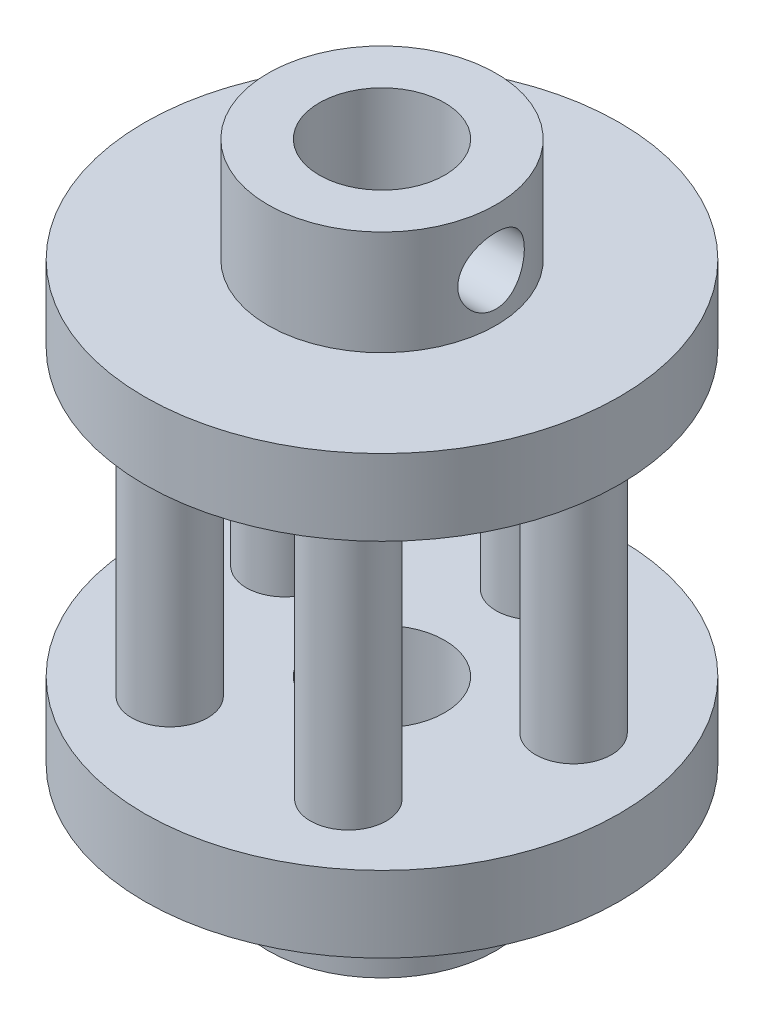
ISO-10303-21;
HEADER;
FILE_DESCRIPTION(('STEP AP214'),'2;1');
FILE_NAME('part.step','',(''),(''),'','','');
FILE_SCHEMA(('AUTOMOTIVE_DESIGN { 1 0 10303 214 1 1 1 1 }'));
ENDSEC;
DATA;
#1=APPLICATION_CONTEXT('core data for automotive mechanical design processes');
#2=APPLICATION_PROTOCOL_DEFINITION('international standard','automotive_design',2000,#1);
#3=PRODUCT_CONTEXT('',#1,'mechanical');
#4=PRODUCT('Part','Part','',(#3));
#5=PRODUCT_RELATED_PRODUCT_CATEGORY('part','',(#4));
#6=PRODUCT_DEFINITION_FORMATION('','',#4);
#7=PRODUCT_DEFINITION_CONTEXT('part definition',#1,'design');
#8=PRODUCT_DEFINITION('design','',#6,#7);
#9=PRODUCT_DEFINITION_SHAPE('','',#8);
#10=(LENGTH_UNIT() NAMED_UNIT(*) SI_UNIT(.MILLI.,.METRE.));
#11=(NAMED_UNIT(*) PLANE_ANGLE_UNIT() SI_UNIT($,.RADIAN.));
#12=(NAMED_UNIT(*) SI_UNIT($,.STERADIAN.) SOLID_ANGLE_UNIT());
#13=UNCERTAINTY_MEASURE_WITH_UNIT(LENGTH_MEASURE(1.E-05),#10,'distance_accuracy_value','');
#14=(GEOMETRIC_REPRESENTATION_CONTEXT(3) GLOBAL_UNCERTAINTY_ASSIGNED_CONTEXT((#13)) GLOBAL_UNIT_ASSIGNED_CONTEXT((#10,
#11,#12)) REPRESENTATION_CONTEXT('',''));
#15=CARTESIAN_POINT('',(0.,0.,0.));
#16=DIRECTION('',(0.,0.,1.));
#17=DIRECTION('',(1.,0.,0.));
#18=AXIS2_PLACEMENT_3D('',#15,#16,#17);
#19=CARTESIAN_POINT('',(0.,23.,0.));
#20=DIRECTION('',(0.,1.,0.));
#21=DIRECTION('',(0.,0.,1.));
#22=AXIS2_PLACEMENT_3D('',#19,#20,#21);
#23=PLANE('',#22);
#24=CARTESIAN_POINT('',(0.,23.,0.));
#25=DIRECTION('',(0.,1.,0.));
#26=DIRECTION('',(0.,0.,1.));
#27=AXIS2_PLACEMENT_3D('',#24,#25,#26);
#28=CIRCLE('',#27,12.5);
#29=CARTESIAN_POINT('',(0.,23.,12.5));
#30=VERTEX_POINT('',#29);
#31=EDGE_CURVE('E91',#30,#30,#28,.T.);
#32=ORIENTED_EDGE('',*,*,#31,.T.);
#33=EDGE_LOOP('',(#32));
#34=FACE_BOUND('',#33,.T.);
#35=CARTESIAN_POINT('',(0.,23.,0.));
#36=DIRECTION('',(0.,1.,0.));
#37=DIRECTION('',(0.,0.,1.));
#38=AXIS2_PLACEMENT_3D('',#35,#36,#37);
#39=CIRCLE('',#38,6.);
#40=CARTESIAN_POINT('',(0.,23.,6.));
#41=VERTEX_POINT('',#40);
#42=EDGE_CURVE('E103',#41,#41,#39,.T.);
#43=ORIENTED_EDGE('',*,*,#42,.F.);
#44=EDGE_LOOP('',(#43));
#45=FACE_BOUND('',#44,.T.);
#46=ADVANCED_FACE('F37',(#34,#45),#23,.T.);
#47=CARTESIAN_POINT('',(0.,0.,0.));
#48=DIRECTION('',(0.,1.,0.));
#49=DIRECTION('',(0.,0.,1.));
#50=AXIS2_PLACEMENT_3D('',#47,#48,#49);
#51=PLANE('',#50);
#52=CARTESIAN_POINT('',(0.,0.,0.));
#53=DIRECTION('',(0.,1.,0.));
#54=DIRECTION('',(0.,0.,1.));
#55=AXIS2_PLACEMENT_3D('',#52,#53,#54);
#56=CIRCLE('',#55,12.5);
#57=CARTESIAN_POINT('',(0.,0.,12.5));
#58=VERTEX_POINT('',#57);
#59=EDGE_CURVE('E48',#58,#58,#56,.T.);
#60=ORIENTED_EDGE('',*,*,#59,.F.);
#61=EDGE_LOOP('',(#60));
#62=FACE_BOUND('',#61,.T.);
#63=CARTESIAN_POINT('',(0.,0.,0.));
#64=DIRECTION('',(0.,1.,0.));
#65=DIRECTION('',(0.,0.,1.));
#66=AXIS2_PLACEMENT_3D('',#63,#64,#65);
#67=CIRCLE('',#66,6.);
#68=CARTESIAN_POINT('',(0.,0.,6.));
#69=VERTEX_POINT('',#68);
#70=EDGE_CURVE('E10',#69,#69,#67,.F.);
#71=ORIENTED_EDGE('',*,*,#70,.F.);
#72=EDGE_LOOP('',(#71));
#73=FACE_BOUND('',#72,.T.);
#74=ADVANCED_FACE('F170',(#62,#73),#51,.F.);
#75=CARTESIAN_POINT('',(0.,4.,0.));
#76=DIRECTION('',(0.,1.,0.));
#77=DIRECTION('',(0.,0.,1.));
#78=AXIS2_PLACEMENT_3D('',#75,#76,#77);
#79=PLANE('',#78);
#80=CARTESIAN_POINT('',(0.,4.,-8.));
#81=DIRECTION('',(0.,1.,0.));
#82=DIRECTION('',(0.,0.,1.));
#83=AXIS2_PLACEMENT_3D('',#80,#81,#82);
#84=CIRCLE('',#83,2.);
#85=CARTESIAN_POINT('',(0.,4.,-6.));
#86=VERTEX_POINT('',#85);
#87=EDGE_CURVE('E88',#86,#86,#84,.T.);
#88=ORIENTED_EDGE('',*,*,#87,.F.);
#89=EDGE_LOOP('',(#88));
#90=FACE_BOUND('',#89,.T.);
#91=CARTESIAN_POINT('',(7.60845213036146,4.,-2.4721359549999));
#92=DIRECTION('',(0.,1.,0.));
#93=DIRECTION('',(0.,0.,1.));
#94=AXIS2_PLACEMENT_3D('',#91,#92,#93);
#95=CIRCLE('',#94,2.00000000000015);
#96=CARTESIAN_POINT('',(7.60845213036146,4.,-0.472135954999751));
#97=VERTEX_POINT('',#96);
#98=EDGE_CURVE('E82',#97,#97,#95,.T.);
#99=ORIENTED_EDGE('',*,*,#98,.F.);
#100=EDGE_LOOP('',(#99));
#101=FACE_BOUND('',#100,.T.);
#102=CARTESIAN_POINT('',(4.7022820183404,4.,6.47213595499938));
#103=DIRECTION('',(0.,1.,0.));
#104=DIRECTION('',(0.,0.,1.));
#105=AXIS2_PLACEMENT_3D('',#102,#103,#104);
#106=CIRCLE('',#105,2.00000000000057);
#107=CARTESIAN_POINT('',(4.7022820183404,4.,8.47213595499995));
#108=VERTEX_POINT('',#107);
#109=EDGE_CURVE('E76',#108,#108,#106,.T.);
#110=ORIENTED_EDGE('',*,*,#109,.F.);
#111=EDGE_LOOP('',(#110));
#112=FACE_BOUND('',#111,.T.);
#113=CARTESIAN_POINT('',(-4.70228201833917,4.,6.47213595499978));
#114=DIRECTION('',(0.,1.,0.));
#115=DIRECTION('',(0.,0.,1.));
#116=AXIS2_PLACEMENT_3D('',#113,#114,#115);
#117=CIRCLE('',#116,2.00000000000071);
#118=CARTESIAN_POINT('',(-4.70228201833917,4.,8.47213595500049));
#119=VERTEX_POINT('',#118);
#120=EDGE_CURVE('E70',#119,#119,#117,.T.);
#121=ORIENTED_EDGE('',*,*,#120,.F.);
#122=EDGE_LOOP('',(#121));
#123=FACE_BOUND('',#122,.T.);
#124=CARTESIAN_POINT('',(-7.60845213036099,4.,-2.47213595499925));
#125=DIRECTION('',(0.,1.,0.));
#126=DIRECTION('',(0.,0.,1.));
#127=AXIS2_PLACEMENT_3D('',#124,#125,#126);
#128=CIRCLE('',#127,2.00000000000041);
#129=CARTESIAN_POINT('',(-7.60845213036099,4.,-0.472135954998848));
#130=VERTEX_POINT('',#129);
#131=EDGE_CURVE('E64',#130,#130,#128,.T.);
#132=ORIENTED_EDGE('',*,*,#131,.F.);
#133=EDGE_LOOP('',(#132));
#134=FACE_BOUND('',#133,.T.);
#135=CARTESIAN_POINT('',(0.,4.,0.));
#136=DIRECTION('',(0.,1.,0.));
#137=DIRECTION('',(0.,0.,1.));
#138=AXIS2_PLACEMENT_3D('',#135,#136,#137);
#139=CIRCLE('',#138,12.5);
#140=CARTESIAN_POINT('',(0.,4.,12.5));
#141=VERTEX_POINT('',#140);
#142=EDGE_CURVE('E44',#141,#141,#139,.T.);
#143=ORIENTED_EDGE('',*,*,#142,.T.);
#144=EDGE_LOOP('',(#143));
#145=FACE_BOUND('',#144,.T.);
#146=CARTESIAN_POINT('',(0.,4.,0.));
#147=DIRECTION('',(0.,1.,0.));
#148=DIRECTION('',(0.,0.,1.));
#149=AXIS2_PLACEMENT_3D('',#146,#147,#148);
#150=CIRCLE('',#149,3.3);
#151=CARTESIAN_POINT('',(0.,4.,3.3));
#152=VERTEX_POINT('',#151);
#153=EDGE_CURVE('E53',#152,#152,#150,.T.);
#154=ORIENTED_EDGE('',*,*,#153,.F.);
#155=EDGE_LOOP('',(#154));
#156=FACE_BOUND('',#155,.T.);
#157=ADVANCED_FACE('F165',(#90,#101,#112,#123,#134,#145,#156),#79,.T.);
#158=CARTESIAN_POINT('',(0.,4.,0.));
#159=DIRECTION('',(0.,-1.,0.));
#160=DIRECTION('',(0.,0.,-1.));
#161=AXIS2_PLACEMENT_3D('',#158,#159,#160);
#162=CYLINDRICAL_SURFACE('',#161,12.5);
#163=ORIENTED_EDGE('',*,*,#142,.F.);
#164=EDGE_LOOP('',(#163));
#165=FACE_BOUND('',#164,.T.);
#166=ORIENTED_EDGE('',*,*,#59,.T.);
#167=EDGE_LOOP('',(#166));
#168=FACE_BOUND('',#167,.T.);
#169=ADVANCED_FACE('F39',(#165,#168),#162,.T.);
#170=CARTESIAN_POINT('',(0.,4.,0.));
#171=DIRECTION('',(0.,-1.,0.));
#172=DIRECTION('',(0.,0.,-1.));
#173=AXIS2_PLACEMENT_3D('',#170,#171,#172);
#174=CYLINDRICAL_SURFACE('',#173,3.3);
#175=CARTESIAN_POINT('',(2.79776696670756,-2.5,-1.75));
#176=CARTESIAN_POINT('',(2.79777610097193,-2.40970111827571,-1.74999315676414));
#177=CARTESIAN_POINT('',(2.80220673679154,-2.31930863394396,-1.74296311903316));
#178=CARTESIAN_POINT('',(2.81925809645072,-2.14137044896176,-1.71523483087788));
#179=CARTESIAN_POINT('',(2.83189392846755,-2.05383031320757,-1.69451136559041));
#180=CARTESIAN_POINT('',(2.86346436594945,-1.88451711787402,-1.64058894021034));
#181=CARTESIAN_POINT('',(2.88236204161611,-1.80271357486261,-1.60746297957464));
#182=CARTESIAN_POINT('',(2.92426807443647,-1.64585053889384,-1.52990003635649));
#183=CARTESIAN_POINT('',(2.94727706046041,-1.57079208031493,-1.48546132292159));
#184=CARTESIAN_POINT('',(2.99743180290491,-1.42182067866784,-1.38167347984665));
#185=CARTESIAN_POINT('',(3.02476320426634,-1.34867035684953,-1.32131900957914));
#186=CARTESIAN_POINT('',(3.07899081322499,-1.21292584042258,-1.18949498194531));
#187=CARTESIAN_POINT('',(3.10588677156603,-1.15033751111203,-1.11801929079466));
#188=CARTESIAN_POINT('',(3.15872295931227,-1.03268696753144,-0.959167009772316));
#189=CARTESIAN_POINT('',(3.18442406417982,-0.978595740573992,-0.870984141796576));
#190=CARTESIAN_POINT('',(3.22950193359304,-0.886368901083243,-0.685149956570084));
#191=CARTESIAN_POINT('',(3.24888317806265,-0.848221980769699,-0.587505410335588));
#192=CARTESIAN_POINT('',(3.27778852143476,-0.792098327266502,-0.393626722391582));
#193=CARTESIAN_POINT('',(3.2879663252076,-0.772774655816521,-0.297882249575791));
#194=CARTESIAN_POINT('',(3.29978586851698,-0.750376345953718,-0.104014586262554));
#195=CARTESIAN_POINT('',(3.30143353448377,-0.747290426115818,-0.0058930948617957));
#196=CARTESIAN_POINT('',(3.29628473857591,-0.757013894803489,0.17967349033787));
#197=CARTESIAN_POINT('',(3.29029618888588,-0.768302312580989,0.267226481283533));
#198=CARTESIAN_POINT('',(3.27181284296009,-0.803684422360388,0.4389782021146));
#199=CARTESIAN_POINT('',(3.25931755317249,-0.827779085749566,0.523176677030306));
#200=CARTESIAN_POINT('',(3.22875357012501,-0.888158346768654,0.687168032779685));
#201=CARTESIAN_POINT('',(3.21061877669572,-0.924587997051758,0.766894676854875));
#202=CARTESIAN_POINT('',(3.17035522503264,-1.00835654053057,0.919275775895601));
#203=CARTESIAN_POINT('',(3.14822511693858,-1.05569912227922,0.991927827823645));
#204=CARTESIAN_POINT('',(3.09930678768058,-1.16551005091124,1.13607595573125));
#205=CARTESIAN_POINT('',(3.07227358337718,-1.22903284705721,1.20668593097103));
#206=CARTESIAN_POINT('',(3.0179556402712,-1.36661859527313,1.3367581968744));
#207=CARTESIAN_POINT('',(2.99067069112895,-1.4406912840602,1.39621007068645));
#208=CARTESIAN_POINT('',(2.93657185581087,-1.60425453539993,1.5068602132404));
#209=CARTESIAN_POINT('',(2.90995950411937,-1.69449603887892,1.55705748482994));
#210=CARTESIAN_POINT('',(2.86335462356856,-1.88383025617603,1.64119890537739));
#211=CARTESIAN_POINT('',(2.84335463464316,-1.98291283405701,1.67516138984613));
#212=CARTESIAN_POINT('',(2.81462356801165,-2.17876279727063,1.72296839091795));
#213=CARTESIAN_POINT('',(2.80511017764091,-2.27506634677015,1.73822100182455));
#214=CARTESIAN_POINT('',(2.79626019129273,-2.46929704117626,1.7524307943686));
#215=CARTESIAN_POINT('',(2.79691401436086,-2.5672225706922,1.75140331733884));
#216=CARTESIAN_POINT('',(2.80749213627963,-2.74823557117652,1.73437358180403));
#217=CARTESIAN_POINT('',(2.81619661852509,-2.83159297756479,1.72034122986245));
#218=CARTESIAN_POINT('',(2.83999840519449,-2.99456811289653,1.68075533666412));
#219=CARTESIAN_POINT('',(2.85509816803609,-3.07418439061907,1.65519736458472));
#220=CARTESIAN_POINT('',(2.89075421153519,-3.23150777110077,1.59213726118069));
#221=CARTESIAN_POINT('',(2.91152375911092,-3.3089714821439,1.55415339548358));
#222=CARTESIAN_POINT('',(2.9560357597137,-3.45688658551602,1.46772438047158));
#223=CARTESIAN_POINT('',(2.97977972753649,-3.52733437176548,1.4192738916007));
#224=CARTESIAN_POINT('',(3.0317010004094,-3.66993269635794,1.30509201403677));
#225=CARTESIAN_POINT('',(3.06002147590517,-3.74084556292999,1.23787298087507));
#226=CARTESIAN_POINT('',(3.11499997031119,-3.87083777428138,1.092172114891));
#227=CARTESIAN_POINT('',(3.14165718597462,-3.92991143148875,1.01368489974554));
#228=CARTESIAN_POINT('',(3.19164128714054,-4.03668141908896,0.843555421924382));
#229=CARTESIAN_POINT('',(3.21479216570475,-4.08382771944153,0.751512357999462));
#230=CARTESIAN_POINT('',(3.25374507643118,-4.16147258026607,0.559222556135352));
#231=CARTESIAN_POINT('',(3.26955430468966,-4.19198744755699,0.458983965091862));
#232=CARTESIAN_POINT('',(3.29076025108248,-4.23259007250645,0.263770456741424));
#233=CARTESIAN_POINT('',(3.2970276188887,-4.24439068215646,0.16924644346361));
#234=CARTESIAN_POINT('',(3.3012989923397,-4.25245276082576,-0.0206330337777912));
#235=CARTESIAN_POINT('',(3.29930670543852,-4.24872120165915,-0.115988105533889));
#236=CARTESIAN_POINT('',(3.28777778610658,-4.2268627637719,-0.296772196570185));
#237=CARTESIAN_POINT('',(3.27885489581663,-4.20990651887266,-0.382386750574915));
#238=CARTESIAN_POINT('',(3.25504301758088,-4.16378907236646,-0.549373979718967));
#239=CARTESIAN_POINT('',(3.24015326596509,-4.13462630848437,-0.630746110383781));
#240=CARTESIAN_POINT('',(3.20500899157281,-4.06382922410128,-0.790483392360905));
#241=CARTESIAN_POINT('',(3.18457093126158,-4.02176024347883,-0.868614212653147));
#242=CARTESIAN_POINT('',(3.14033807917206,-3.92687910159846,-1.0169960386773));
#243=CARTESIAN_POINT('',(3.11654182851414,-3.87406226678026,-1.0872435957908));
#244=CARTESIAN_POINT('',(3.06479689312036,-3.75252900457779,-1.2260030447336));
#245=CARTESIAN_POINT('',(3.03667876361633,-3.68270517154392,-1.29348382949984));
#246=CARTESIAN_POINT('',(2.9814130335849,-3.53256656574842,-1.41623407858257));
#247=CARTESIAN_POINT('',(2.95426651115643,-3.4522405729871,-1.47149031034735));
#248=CARTESIAN_POINT('',(2.90270728743635,-3.27812341744352,-1.57085519225081));
#249=CARTESIAN_POINT('',(2.87850878899608,-3.18385052456708,-1.61423889165504));
#250=CARTESIAN_POINT('',(2.83835137915012,-2.98768303651593,-1.68386807559071));
#251=CARTESIAN_POINT('',(2.8223654631534,-2.88581469864984,-1.71016980537098));
#252=CARTESIAN_POINT('',(2.80727900424339,-2.73554203040832,-1.73471897868139));
#253=CARTESIAN_POINT('',(2.80372913486605,-2.68869791980486,-1.74043759432916));
#254=CARTESIAN_POINT('',(2.79897067169609,-2.59457778047884,-1.74807998159971));
#255=CARTESIAN_POINT('',(2.79776218185836,-2.54730173267234,-1.75000358472782));
#256=CARTESIAN_POINT('',(2.79776696670756,-2.5,-1.75));
#257=B_SPLINE_CURVE_WITH_KNOTS('',3,(#175,#176,#177,#178,#179,#180,#181,#182,#183,#184,#185,
#186,#187,#188,#189,#190,#191,#192,#193,#194,#195,#196,#197,#198,#199,#200,#201,#202,#203,#204,
#205,#206,#207,#208,#209,#210,#211,#212,#213,#214,#215,#216,#217,#218,#219,#220,#221,#222,#223,
#224,#225,#226,#227,#228,#229,#230,#231,#232,#233,#234,#235,#236,#237,#238,#239,#240,#241,#242,
#243,#244,#245,#246,#247,#248,#249,#250,#251,#252,#253,#254,#255,#256),.UNSPECIFIED.,.T.,.F.,(4,
2,2,2,2,2,2,2,2,2,2,2,2,2,2,2,2,2,2,2,2,2,2,2,2,2,2,2,2,2,2,2,2,2,2,2,2,2,2,2,4),(0.,
0.270696743440975,0.54189333789938,0.811518176862036,1.08118429327482,1.37605238985516,
1.67108369790039,1.98918138412293,2.30705308954471,2.60000213152748,2.89274761580509,
3.15694058202382,3.42115359083174,3.68858821536293,3.95611336524682,4.25113164051829,
4.54642398026746,4.86467342732121,5.18256259036667,5.47467299847998,5.76650815646815,
6.0202933003291,6.27417609072077,6.53937847483659,6.80471647300509,7.1085767080704,
7.4125825699238,7.72875657781247,8.0446200225614,8.32944002507899,8.61413219625857,
8.87614154900708,9.13818444579246,9.41025790536816,9.68244992622183,9.98442734705671,
10.2867300632316,10.6046784458854,10.9215745500785,11.0633687371573,11.2051692196108),.UNSPECIFIED.);
#258=CARTESIAN_POINT('',(2.79776696670756,-2.5,-1.75));
#259=VERTEX_POINT('',#258);
#260=EDGE_CURVE('E119',#259,#259,#257,.T.);
#261=ORIENTED_EDGE('',*,*,#260,.T.);
#262=EDGE_LOOP('',(#261));
#263=FACE_BOUND('',#262,.T.);
#264=ORIENTED_EDGE('',*,*,#153,.T.);
#265=EDGE_LOOP('',(#264));
#266=FACE_BOUND('',#265,.T.);
#267=CARTESIAN_POINT('',(0.,-5.5,0.));
#268=DIRECTION('',(0.,-1.,0.));
#269=DIRECTION('',(0.,0.,-1.));
#270=AXIS2_PLACEMENT_3D('',#267,#268,#269);
#271=CIRCLE('',#270,3.3);
#272=CARTESIAN_POINT('',(0.,-5.5,-3.3));
#273=VERTEX_POINT('',#272);
#274=EDGE_CURVE('E60',#273,#273,#271,.T.);
#275=ORIENTED_EDGE('',*,*,#274,.T.);
#276=EDGE_LOOP('',(#275));
#277=FACE_BOUND('',#276,.T.);
#278=ADVANCED_FACE('F155',(#263,#266,#277),#174,.F.);
#279=CARTESIAN_POINT('',(0.,-5.5,0.));
#280=DIRECTION('',(0.,-1.,0.));
#281=DIRECTION('',(0.,0.,-1.));
#282=AXIS2_PLACEMENT_3D('',#279,#280,#281);
#283=PLANE('',#282);
#284=CARTESIAN_POINT('',(0.,-5.5,0.));
#285=DIRECTION('',(0.,-1.,0.));
#286=DIRECTION('',(0.,0.,-1.));
#287=AXIS2_PLACEMENT_3D('',#284,#285,#286);
#288=CIRCLE('',#287,6.);
#289=CARTESIAN_POINT('',(0.,-5.5,-6.));
#290=VERTEX_POINT('',#289);
#291=EDGE_CURVE('E57',#290,#290,#288,.T.);
#292=ORIENTED_EDGE('',*,*,#291,.T.);
#293=EDGE_LOOP('',(#292));
#294=FACE_BOUND('',#293,.T.);
#295=ORIENTED_EDGE('',*,*,#274,.F.);
#296=EDGE_LOOP('',(#295));
#297=FACE_BOUND('',#296,.T.);
#298=ADVANCED_FACE('F149',(#294,#297),#283,.T.);
#299=CARTESIAN_POINT('',(0.,-5.5,0.));
#300=DIRECTION('',(0.,1.,0.));
#301=DIRECTION('',(0.,0.,1.));
#302=AXIS2_PLACEMENT_3D('',#299,#300,#301);
#303=CYLINDRICAL_SURFACE('',#302,6.);
#304=CARTESIAN_POINT('',(5.7391201416245,-2.5,-1.75));
#305=CARTESIAN_POINT('',(5.73912135233218,-2.40397284004448,-1.74999848143229));
#306=CARTESIAN_POINT('',(5.74155660684103,-2.30793050555226,-1.74206920201931));
#307=CARTESIAN_POINT('',(5.75099819259011,-2.11864484452936,-1.71063758772276));
#308=CARTESIAN_POINT('',(5.75800624523015,-2.02540258590105,-1.687129388205));
#309=CARTESIAN_POINT('',(5.77573366437414,-1.8444840172599,-1.62539891018832));
#310=CARTESIAN_POINT('',(5.78644710700006,-1.7567990858153,-1.58720010699206));
#311=CARTESIAN_POINT('',(5.8103702792937,-1.58906262104433,-1.49724903480251));
#312=CARTESIAN_POINT('',(5.82358033749983,-1.50901209444448,-1.44549498168001));
#313=CARTESIAN_POINT('',(5.8514513800029,-1.35642235943304,-1.32824554329378));
#314=CARTESIAN_POINT('',(5.8661419700001,-1.28414529138837,-1.26241596701889));
#315=CARTESIAN_POINT('',(5.89506524619861,-1.15148437969116,-1.11960099692238));
#316=CARTESIAN_POINT('',(5.90929787649124,-1.09110198359064,-1.04261424727684));
#317=CARTESIAN_POINT('',(5.93603636207228,-0.982817952354761,-0.877817715970357));
#318=CARTESIAN_POINT('',(5.94850325436041,-0.935181865224529,-0.789826574692591));
#319=CARTESIAN_POINT('',(5.96996273194609,-0.855483085120647,-0.606657775834809));
#320=CARTESIAN_POINT('',(5.97895602343648,-0.823417226334454,-0.511481583704489));
#321=CARTESIAN_POINT('',(5.99224555879575,-0.776631659851419,-0.319385326415656));
#322=CARTESIAN_POINT('',(5.9966626309077,-0.761464890679511,-0.222582653190642));
#323=CARTESIAN_POINT('',(6.0007267618746,-0.747496260976773,-0.0277126943123472));
#324=CARTESIAN_POINT('',(6.00037476953799,-0.748691145284952,0.070354335917702));
#325=CARTESIAN_POINT('',(5.99502665675503,-0.767107975120797,0.261839339010208));
#326=CARTESIAN_POINT('',(5.99017073825665,-0.783846096452185,0.355308373260202));
#327=CARTESIAN_POINT('',(5.97652948220135,-0.83208620846097,0.538048126317029));
#328=CARTESIAN_POINT('',(5.96774390133059,-0.863589113338755,0.627318584781339));
#329=CARTESIAN_POINT('',(5.94703299959619,-0.94080317469349,0.800299191226943));
#330=CARTESIAN_POINT('',(5.93507351157704,-0.986669989640289,0.883935598008258));
#331=CARTESIAN_POINT('',(5.9092886595426,-1.0911877761099,1.04248200075495));
#332=CARTESIAN_POINT('',(5.89546287280477,-1.14984164579744,1.11739001252847));
#333=CARTESIAN_POINT('',(5.86683410672761,-1.28079366572752,1.25924141940852));
#334=CARTESIAN_POINT('',(5.85201387983932,-1.35351185752698,1.32579407024834));
#335=CARTESIAN_POINT('',(5.82351168097608,-1.50922420966148,1.44586660191142));
#336=CARTESIAN_POINT('',(5.8098298096845,-1.59221927733663,1.49938533073701));
#337=CARTESIAN_POINT('',(5.78507419356832,-1.76711038598652,1.59224878530753));
#338=CARTESIAN_POINT('',(5.77402396450966,-1.85907703134393,1.63146726373796));
#339=CARTESIAN_POINT('',(5.75606450322795,-2.04870501814748,1.69374851164605));
#340=CARTESIAN_POINT('',(5.74915400670723,-2.14636461092672,1.71681621402541));
#341=CARTESIAN_POINT('',(5.74053185916609,-2.34090391717076,1.7454256721976));
#342=CARTESIAN_POINT('',(5.73864494944326,-2.43768901211583,1.75155853244336));
#343=CARTESIAN_POINT('',(5.73980029830615,-2.63090622420585,1.74776921645584));
#344=CARTESIAN_POINT('',(5.74284191154791,-2.72733838590703,1.73784914220432));
#345=CARTESIAN_POINT('',(5.75334026618617,-2.91469683191571,1.70276068513146));
#346=CARTESIAN_POINT('',(5.76068862380037,-3.00569983887287,1.67796628113717));
#347=CARTESIAN_POINT('',(5.77886185683533,-3.18225019673579,1.61426316316258));
#348=CARTESIAN_POINT('',(5.7896872485818,-3.26779673511495,1.57535235284098));
#349=CARTESIAN_POINT('',(5.81393978491672,-3.43342785400945,1.48337952129907));
#350=CARTESIAN_POINT('',(5.82742647058964,-3.51331639682906,1.42998054711139));
#351=CARTESIAN_POINT('',(5.85535101590732,-3.66321520252723,1.31095181227824));
#352=CARTESIAN_POINT('',(5.86978909009026,-3.73322322608859,1.24531928682211));
#353=CARTESIAN_POINT('',(5.89860806740746,-3.86392465142804,1.10091901276198));
#354=CARTESIAN_POINT('',(5.91296886248222,-3.92420070351042,1.02176859620353));
#355=CARTESIAN_POINT('',(5.93949812101069,-4.03062138800924,0.854138226573397));
#356=CARTESIAN_POINT('',(5.95166669713258,-4.07676674675218,0.765658753335441));
#357=CARTESIAN_POINT('',(5.97236405546361,-4.15317278485004,0.582484879123573));
#358=CARTESIAN_POINT('',(5.98092021102961,-4.18355334099557,0.487843729255372));
#359=CARTESIAN_POINT('',(5.99354961087299,-4.22788733862535,0.294506890790337));
#360=CARTESIAN_POINT('',(5.99762406124125,-4.24184519976193,0.195812300452465));
#361=CARTESIAN_POINT('',(6.00076178273783,-4.25261657574943,0.0010374396196633));
#362=CARTESIAN_POINT('',(6.00000245868248,-4.25003700717416,-0.0950068407311685));
#363=CARTESIAN_POINT('',(5.99397167828825,-4.22924676942971,-0.285235716014248));
#364=CARTESIAN_POINT('',(5.98870045407916,-4.21103690441326,-0.379420406364288));
#365=CARTESIAN_POINT('',(5.97428492757917,-4.15987089762037,-0.562376479895317));
#366=CARTESIAN_POINT('',(5.96517853614574,-4.12705892326945,-0.651191371275259));
#367=CARTESIAN_POINT('',(5.94403648997228,-4.04774855675863,-0.822103394195301));
#368=CARTESIAN_POINT('',(5.93200036970177,-4.00124798925122,-0.904199455348202));
#369=CARTESIAN_POINT('',(5.90580993303637,-3.89422345183415,-1.06207963183778));
#370=CARTESIAN_POINT('',(5.89160195176128,-3.83331295026023,-1.13759275881333));
#371=CARTESIAN_POINT('',(5.86285183048808,-3.69990313108954,-1.27752965774599));
#372=CARTESIAN_POINT('',(5.84830959756853,-3.62740055671825,-1.34195030269254));
#373=CARTESIAN_POINT('',(5.82006568044674,-3.47045204410667,-1.45966022673122));
#374=CARTESIAN_POINT('',(5.80639844866527,-3.38573085169033,-1.51259163845184));
#375=CARTESIAN_POINT('',(5.78198514023874,-3.20820584653625,-1.60339388987167));
#376=CARTESIAN_POINT('',(5.77123752324486,-3.11540633007095,-1.64127267603193));
#377=CARTESIAN_POINT('',(5.75505738666475,-2.93607284987205,-1.69707126506049));
#378=CARTESIAN_POINT('',(5.74913519026072,-2.85016306205154,-1.71686706269423));
#379=CARTESIAN_POINT('',(5.74116635043196,-2.67617285208128,-1.74333098170632));
#380=CARTESIAN_POINT('',(5.73911903095286,-2.58809281129519,-1.7500013930944));
#381=CARTESIAN_POINT('',(5.7391201416245,-2.5,-1.75));
#382=B_SPLINE_CURVE_WITH_KNOTS('',3,(#304,#305,#306,#307,#308,#309,#310,#311,#312,#313,#314,
#315,#316,#317,#318,#319,#320,#321,#322,#323,#324,#325,#326,#327,#328,#329,#330,#331,#332,#333,
#334,#335,#336,#337,#338,#339,#340,#341,#342,#343,#344,#345,#346,#347,#348,#349,#350,#351,#352,
#353,#354,#355,#356,#357,#358,#359,#360,#361,#362,#363,#364,#365,#366,#367,#368,#369,#370,#371,
#372,#373,#374,#375,#376,#377,#378,#379,#380,#381),.UNSPECIFIED.,.T.,.F.,(4,2,2,2,2,2,2,2,2,2,2,
2,2,2,2,2,2,2,2,2,2,2,2,2,2,2,2,2,2,2,2,2,2,2,2,2,2,2,4),(0.,0.287756797222522,
0.575621981143362,0.863029060661796,1.15047398745512,1.44570366788229,1.74096925486194,
2.04197684943756,2.3429232160698,2.63570371118683,2.92842595829134,3.21233131865284,
3.49625426008392,3.78336718563481,4.07054525263202,4.36821044004191,4.66590192692268,
4.96616130350709,5.26632893237125,5.55587830513257,5.84538976717713,6.12791051105674,
6.41047322755234,6.70027379224019,6.99013993210847,7.29026491272893,7.5903744641468,
7.88816722411909,8.18587982418321,8.47273065365,8.75956672600379,9.04363159851128,
9.32774163809379,9.62056977394217,9.91348032442504,10.2145064741217,10.5153734967276,
10.7794001445159,11.0433807230145),.UNSPECIFIED.);
#383=CARTESIAN_POINT('',(5.7391201416245,-2.5,-1.75));
#384=VERTEX_POINT('',#383);
#385=EDGE_CURVE('E137',#384,#384,#382,.T.);
#386=ORIENTED_EDGE('',*,*,#385,.F.);
#387=EDGE_LOOP('',(#386));
#388=FACE_BOUND('',#387,.T.);
#389=ORIENTED_EDGE('',*,*,#291,.F.);
#390=EDGE_LOOP('',(#389));
#391=FACE_BOUND('',#390,.T.);
#392=ORIENTED_EDGE('',*,*,#70,.T.);
#393=EDGE_LOOP('',(#392));
#394=FACE_BOUND('',#393,.T.);
#395=ADVANCED_FACE('F145',(#388,#391,#394),#303,.T.);
#396=CARTESIAN_POINT('',(-7.60845213036099,19.,-2.47213595499925));
#397=DIRECTION('',(0.,-1.,0.));
#398=DIRECTION('',(0.,0.,-1.));
#399=AXIS2_PLACEMENT_3D('',#396,#397,#398);
#400=CYLINDRICAL_SURFACE('',#399,2.00000000000041);
#401=CARTESIAN_POINT('',(-7.60845213036099,19.,-2.47213595499925));
#402=DIRECTION('',(0.,1.,0.));
#403=DIRECTION('',(0.,0.,1.));
#404=AXIS2_PLACEMENT_3D('',#401,#402,#403);
#405=CIRCLE('',#404,2.00000000000041);
#406=CARTESIAN_POINT('',(-7.60845213036099,19.,-0.472135954998848));
#407=VERTEX_POINT('',#406);
#408=EDGE_CURVE('E63',#407,#407,#405,.T.);
#409=ORIENTED_EDGE('',*,*,#408,.F.);
#410=EDGE_LOOP('',(#409));
#411=FACE_BOUND('',#410,.T.);
#412=ORIENTED_EDGE('',*,*,#131,.T.);
#413=EDGE_LOOP('',(#412));
#414=FACE_BOUND('',#413,.T.);
#415=ADVANCED_FACE('F148',(#411,#414),#400,.T.);
#416=CARTESIAN_POINT('',(-4.70228201833917,19.,6.47213595499978));
#417=DIRECTION('',(0.,-1.,0.));
#418=DIRECTION('',(0.,0.,-1.));
#419=AXIS2_PLACEMENT_3D('',#416,#417,#418);
#420=CYLINDRICAL_SURFACE('',#419,2.00000000000071);
#421=CARTESIAN_POINT('',(-4.70228201833917,19.,6.47213595499978));
#422=DIRECTION('',(0.,1.,0.));
#423=DIRECTION('',(0.,0.,1.));
#424=AXIS2_PLACEMENT_3D('',#421,#422,#423);
#425=CIRCLE('',#424,2.00000000000071);
#426=CARTESIAN_POINT('',(-4.70228201833917,19.,8.47213595500049));
#427=VERTEX_POINT('',#426);
#428=EDGE_CURVE('E67',#427,#427,#425,.T.);
#429=ORIENTED_EDGE('',*,*,#428,.F.);
#430=EDGE_LOOP('',(#429));
#431=FACE_BOUND('',#430,.T.);
#432=ORIENTED_EDGE('',*,*,#120,.T.);
#433=EDGE_LOOP('',(#432));
#434=FACE_BOUND('',#433,.T.);
#435=ADVANCED_FACE('F201',(#431,#434),#420,.T.);
#436=CARTESIAN_POINT('',(4.7022820183404,19.,6.47213595499938));
#437=DIRECTION('',(0.,-1.,0.));
#438=DIRECTION('',(0.,0.,-1.));
#439=AXIS2_PLACEMENT_3D('',#436,#437,#438);
#440=CYLINDRICAL_SURFACE('',#439,2.00000000000057);
#441=CARTESIAN_POINT('',(4.7022820183404,19.,6.47213595499938));
#442=DIRECTION('',(0.,1.,0.));
#443=DIRECTION('',(0.,0.,1.));
#444=AXIS2_PLACEMENT_3D('',#441,#442,#443);
#445=CIRCLE('',#444,2.00000000000057);
#446=CARTESIAN_POINT('',(4.7022820183404,19.,8.47213595499995));
#447=VERTEX_POINT('',#446);
#448=EDGE_CURVE('E73',#447,#447,#445,.T.);
#449=ORIENTED_EDGE('',*,*,#448,.F.);
#450=EDGE_LOOP('',(#449));
#451=FACE_BOUND('',#450,.T.);
#452=ORIENTED_EDGE('',*,*,#109,.T.);
#453=EDGE_LOOP('',(#452));
#454=FACE_BOUND('',#453,.T.);
#455=ADVANCED_FACE('F197',(#451,#454),#440,.T.);
#456=CARTESIAN_POINT('',(7.60845213036146,19.,-2.4721359549999));
#457=DIRECTION('',(0.,-1.,0.));
#458=DIRECTION('',(0.,0.,-1.));
#459=AXIS2_PLACEMENT_3D('',#456,#457,#458);
#460=CYLINDRICAL_SURFACE('',#459,2.00000000000015);
#461=CARTESIAN_POINT('',(7.60845213036146,19.,-2.4721359549999));
#462=DIRECTION('',(0.,1.,0.));
#463=DIRECTION('',(0.,0.,1.));
#464=AXIS2_PLACEMENT_3D('',#461,#462,#463);
#465=CIRCLE('',#464,2.00000000000015);
#466=CARTESIAN_POINT('',(7.60845213036146,19.,-0.472135954999751));
#467=VERTEX_POINT('',#466);
#468=EDGE_CURVE('E79',#467,#467,#465,.T.);
#469=ORIENTED_EDGE('',*,*,#468,.F.);
#470=EDGE_LOOP('',(#469));
#471=FACE_BOUND('',#470,.T.);
#472=ORIENTED_EDGE('',*,*,#98,.T.);
#473=EDGE_LOOP('',(#472));
#474=FACE_BOUND('',#473,.T.);
#475=ADVANCED_FACE('F193',(#471,#474),#460,.T.);
#476=CARTESIAN_POINT('',(0.,19.,-8.));
#477=DIRECTION('',(0.,-1.,0.));
#478=DIRECTION('',(0.,0.,-1.));
#479=AXIS2_PLACEMENT_3D('',#476,#477,#478);
#480=CYLINDRICAL_SURFACE('',#479,2.);
#481=CARTESIAN_POINT('',(0.,19.,-8.));
#482=DIRECTION('',(0.,1.,0.));
#483=DIRECTION('',(0.,0.,1.));
#484=AXIS2_PLACEMENT_3D('',#481,#482,#483);
#485=CIRCLE('',#484,2.);
#486=CARTESIAN_POINT('',(0.,19.,-6.));
#487=VERTEX_POINT('',#486);
#488=EDGE_CURVE('E85',#487,#487,#485,.T.);
#489=ORIENTED_EDGE('',*,*,#488,.F.);
#490=EDGE_LOOP('',(#489));
#491=FACE_BOUND('',#490,.T.);
#492=ORIENTED_EDGE('',*,*,#87,.T.);
#493=EDGE_LOOP('',(#492));
#494=FACE_BOUND('',#493,.T.);
#495=ADVANCED_FACE('F186',(#491,#494),#480,.T.);
#496=CARTESIAN_POINT('',(0.,19.,0.));
#497=DIRECTION('',(0.,1.,0.));
#498=DIRECTION('',(0.,0.,1.));
#499=AXIS2_PLACEMENT_3D('',#496,#497,#498);
#500=PLANE('',#499);
#501=ORIENTED_EDGE('',*,*,#408,.T.);
#502=EDGE_LOOP('',(#501));
#503=FACE_BOUND('',#502,.T.);
#504=ORIENTED_EDGE('',*,*,#428,.T.);
#505=EDGE_LOOP('',(#504));
#506=FACE_BOUND('',#505,.T.);
#507=ORIENTED_EDGE('',*,*,#448,.T.);
#508=EDGE_LOOP('',(#507));
#509=FACE_BOUND('',#508,.T.);
#510=ORIENTED_EDGE('',*,*,#468,.T.);
#511=EDGE_LOOP('',(#510));
#512=FACE_BOUND('',#511,.T.);
#513=ORIENTED_EDGE('',*,*,#488,.T.);
#514=EDGE_LOOP('',(#513));
#515=FACE_BOUND('',#514,.T.);
#516=CARTESIAN_POINT('',(0.,19.,0.));
#517=DIRECTION('',(0.,1.,0.));
#518=DIRECTION('',(0.,0.,1.));
#519=AXIS2_PLACEMENT_3D('',#516,#517,#518);
#520=CIRCLE('',#519,12.5);
#521=CARTESIAN_POINT('',(0.,19.,12.5));
#522=VERTEX_POINT('',#521);
#523=EDGE_CURVE('E94',#522,#522,#520,.T.);
#524=ORIENTED_EDGE('',*,*,#523,.F.);
#525=EDGE_LOOP('',(#524));
#526=FACE_BOUND('',#525,.T.);
#527=CARTESIAN_POINT('',(0.,19.,0.));
#528=DIRECTION('',(0.,1.,0.));
#529=DIRECTION('',(0.,0.,1.));
#530=AXIS2_PLACEMENT_3D('',#527,#528,#529);
#531=CIRCLE('',#530,3.3);
#532=CARTESIAN_POINT('',(0.,19.,3.3));
#533=VERTEX_POINT('',#532);
#534=EDGE_CURVE('E97',#533,#533,#531,.T.);
#535=ORIENTED_EDGE('',*,*,#534,.T.);
#536=EDGE_LOOP('',(#535));
#537=FACE_BOUND('',#536,.T.);
#538=ADVANCED_FACE('F182',(#503,#506,#509,#512,#515,#526,#537),#500,.F.);
#539=CARTESIAN_POINT('',(0.,23.,0.));
#540=DIRECTION('',(0.,-1.,0.));
#541=DIRECTION('',(0.,0.,-1.));
#542=AXIS2_PLACEMENT_3D('',#539,#540,#541);
#543=CYLINDRICAL_SURFACE('',#542,12.5);
#544=ORIENTED_EDGE('',*,*,#31,.F.);
#545=EDGE_LOOP('',(#544));
#546=FACE_BOUND('',#545,.T.);
#547=ORIENTED_EDGE('',*,*,#523,.T.);
#548=EDGE_LOOP('',(#547));
#549=FACE_BOUND('',#548,.T.);
#550=ADVANCED_FACE('F185',(#546,#549),#543,.T.);
#551=CARTESIAN_POINT('',(0.,23.,0.));
#552=DIRECTION('',(0.,-1.,0.));
#553=DIRECTION('',(0.,0.,-1.));
#554=AXIS2_PLACEMENT_3D('',#551,#552,#553);
#555=CYLINDRICAL_SURFACE('',#554,3.3);
#556=CARTESIAN_POINT('',(2.79776696670756,25.5,-1.75));
#557=CARTESIAN_POINT('',(2.79777610097192,25.5902988817243,-1.74999315676414));
#558=CARTESIAN_POINT('',(2.80220673679154,25.680691366056,-1.74296311903316));
#559=CARTESIAN_POINT('',(2.81925809645072,25.8586295510382,-1.71523483087789));
#560=CARTESIAN_POINT('',(2.83189392846755,25.9461696867924,-1.69451136559041));
#561=CARTESIAN_POINT('',(2.86346436594945,26.115482882126,-1.64058894021034));
#562=CARTESIAN_POINT('',(2.88236204161611,26.1972864251374,-1.60746297957464));
#563=CARTESIAN_POINT('',(2.92426807443647,26.3541494611062,-1.52990003635649));
#564=CARTESIAN_POINT('',(2.9472770604604,26.4292079196851,-1.48546132292159));
#565=CARTESIAN_POINT('',(2.99743180290491,26.5781793213322,-1.38167347984665));
#566=CARTESIAN_POINT('',(3.02476320426634,26.6513296431505,-1.32131900957915));
#567=CARTESIAN_POINT('',(3.07899081322499,26.7870741595774,-1.18949498194531));
#568=CARTESIAN_POINT('',(3.10588677156603,26.849662488888,-1.11801929079466));
#569=CARTESIAN_POINT('',(3.15872295931227,26.9673130324686,-0.959167009772317));
#570=CARTESIAN_POINT('',(3.18442406417982,27.021404259426,-0.870984141796578));
#571=CARTESIAN_POINT('',(3.22950193359304,27.1136310989168,-0.685149956570086));
#572=CARTESIAN_POINT('',(3.24888317806265,27.1517780192303,-0.58750541033559));
#573=CARTESIAN_POINT('',(3.27778852143477,27.2079016727335,-0.393626722391584));
#574=CARTESIAN_POINT('',(3.2879663252076,27.2272253441835,-0.297882249575793));
#575=CARTESIAN_POINT('',(3.29978586851698,27.2496236540463,-0.104014586262556));
#576=CARTESIAN_POINT('',(3.30143353448377,27.2527095738842,-0.00589309486179755));
#577=CARTESIAN_POINT('',(3.29628473857591,27.2429861051965,0.179673490337868));
#578=CARTESIAN_POINT('',(3.29029618888588,27.231697687419,0.267226481283531));
#579=CARTESIAN_POINT('',(3.27181284296009,27.1963155776396,0.438978202114599));
#580=CARTESIAN_POINT('',(3.25931755317249,27.1722209142504,0.523176677030305));
#581=CARTESIAN_POINT('',(3.22875357012501,27.1118416532313,0.687168032779685));
#582=CARTESIAN_POINT('',(3.21061877669572,27.0754120029482,0.766894676854875));
#583=CARTESIAN_POINT('',(3.17035522503265,26.9916434594694,0.9192757758956));
#584=CARTESIAN_POINT('',(3.14822511693858,26.9443008777208,0.991927827823644));
#585=CARTESIAN_POINT('',(3.09930678768058,26.8344899490888,1.13607595573125));
#586=CARTESIAN_POINT('',(3.07227358337718,26.7709671529428,1.20668593097103));
#587=CARTESIAN_POINT('',(3.0179556402712,26.6333814047269,1.3367581968744));
#588=CARTESIAN_POINT('',(2.99067069112895,26.5593087159398,1.39621007068645));
#589=CARTESIAN_POINT('',(2.93657185581087,26.3957454646001,1.5068602132404));
#590=CARTESIAN_POINT('',(2.90995950411937,26.3055039611211,1.55705748482994));
#591=CARTESIAN_POINT('',(2.86335462356856,26.116169743824,1.64119890537739));
#592=CARTESIAN_POINT('',(2.84335463464316,26.017087165943,1.67516138984613));
#593=CARTESIAN_POINT('',(2.81462356801165,25.8212372027294,1.72296839091795));
#594=CARTESIAN_POINT('',(2.80511017764091,25.7249336532298,1.73822100182455));
#595=CARTESIAN_POINT('',(2.79626019129273,25.5307029588237,1.7524307943686));
#596=CARTESIAN_POINT('',(2.79691401436086,25.4327774293078,1.75140331733884));
#597=CARTESIAN_POINT('',(2.80749213627963,25.2517644288235,1.73437358180403));
#598=CARTESIAN_POINT('',(2.81619661852509,25.1684070224352,1.72034122986245));
#599=CARTESIAN_POINT('',(2.83999840519449,25.0054318871035,1.68075533666412));
#600=CARTESIAN_POINT('',(2.85509816803609,24.9258156093809,1.65519736458472));
#601=CARTESIAN_POINT('',(2.89075421153519,24.7684922288992,1.59213726118069));
#602=CARTESIAN_POINT('',(2.91152375911092,24.6910285178561,1.55415339548358));
#603=CARTESIAN_POINT('',(2.9560357597137,24.543113414484,1.46772438047158));
#604=CARTESIAN_POINT('',(2.97977972753649,24.4726656282345,1.41927389160071));
#605=CARTESIAN_POINT('',(3.0317010004094,24.3300673036421,1.30509201403677));
#606=CARTESIAN_POINT('',(3.06002147590517,24.25915443707,1.23787298087507));
#607=CARTESIAN_POINT('',(3.11499997031119,24.1291622257186,1.092172114891));
#608=CARTESIAN_POINT('',(3.14165718597462,24.0700885685112,1.01368489974554));
#609=CARTESIAN_POINT('',(3.19164128714054,23.963318580911,0.843555421924383));
#610=CARTESIAN_POINT('',(3.21479216570475,23.9161722805585,0.751512357999463));
#611=CARTESIAN_POINT('',(3.25374507643118,23.8385274197339,0.559222556135353));
#612=CARTESIAN_POINT('',(3.26955430468966,23.808012552443,0.458983965091863));
#613=CARTESIAN_POINT('',(3.29076025108248,23.7674099274935,0.263770456741425));
#614=CARTESIAN_POINT('',(3.2970276188887,23.7556093178435,0.16924644346361));
#615=CARTESIAN_POINT('',(3.3012989923397,23.7475472391742,-0.0206330337777911));
#616=CARTESIAN_POINT('',(3.29930670543852,23.7512787983408,-0.115988105533889));
#617=CARTESIAN_POINT('',(3.28777778610658,23.7731372362281,-0.296772196570185));
#618=CARTESIAN_POINT('',(3.27885489581663,23.7900934811273,-0.382386750574914));
#619=CARTESIAN_POINT('',(3.25504301758088,23.8362109276335,-0.549373979718967));
#620=CARTESIAN_POINT('',(3.24015326596509,23.8653736915156,-0.63074611038378));
#621=CARTESIAN_POINT('',(3.20500899157281,23.9361707758987,-0.790483392360904));
#622=CARTESIAN_POINT('',(3.18457093126158,23.9782397565212,-0.868614212653146));
#623=CARTESIAN_POINT('',(3.14033807917206,24.0731208984015,-1.0169960386773));
#624=CARTESIAN_POINT('',(3.11654182851414,24.1259377332197,-1.0872435957908));
#625=CARTESIAN_POINT('',(3.06479689312036,24.2474709954222,-1.2260030447336));
#626=CARTESIAN_POINT('',(3.03667876361633,24.3172948284561,-1.29348382949984));
#627=CARTESIAN_POINT('',(2.9814130335849,24.4674334342516,-1.41623407858257));
#628=CARTESIAN_POINT('',(2.95426651115643,24.5477594270129,-1.47149031034735));
#629=CARTESIAN_POINT('',(2.90270728743635,24.7218765825565,-1.57085519225081));
#630=CARTESIAN_POINT('',(2.87850878899608,24.8161494754329,-1.61423889165504));
#631=CARTESIAN_POINT('',(2.83835137915012,25.0123169634841,-1.68386807559071));
#632=CARTESIAN_POINT('',(2.8223654631534,25.1141853013502,-1.71016980537098));
#633=CARTESIAN_POINT('',(2.80727900424339,25.2644579695917,-1.73471897868139));
#634=CARTESIAN_POINT('',(2.80372913486605,25.3113020801951,-1.74043759432916));
#635=CARTESIAN_POINT('',(2.79897067169609,25.4054222195212,-1.74807998159971));
#636=CARTESIAN_POINT('',(2.79776218185836,25.4526982673277,-1.75000358472782));
#637=CARTESIAN_POINT('',(2.79776696670756,25.5,-1.75));
#638=B_SPLINE_CURVE_WITH_KNOTS('',3,(#556,#557,#558,#559,#560,#561,#562,#563,#564,#565,#566,
#567,#568,#569,#570,#571,#572,#573,#574,#575,#576,#577,#578,#579,#580,#581,#582,#583,#584,#585,
#586,#587,#588,#589,#590,#591,#592,#593,#594,#595,#596,#597,#598,#599,#600,#601,#602,#603,#604,
#605,#606,#607,#608,#609,#610,#611,#612,#613,#614,#615,#616,#617,#618,#619,#620,#621,#622,#623,
#624,#625,#626,#627,#628,#629,#630,#631,#632,#633,#634,#635,#636,#637),.UNSPECIFIED.,.T.,.F.,(4,
2,2,2,2,2,2,2,2,2,2,2,2,2,2,2,2,2,2,2,2,2,2,2,2,2,2,2,2,2,2,2,2,2,2,2,2,2,2,2,4),(0.,
0.270696743440976,0.541893337899381,0.811518176862035,1.08118429327483,1.37605238985516,
1.6710836979004,1.98918138412293,2.30705308954471,2.60000213152748,2.89274761580509,
3.15694058202382,3.42115359083174,3.68858821536293,3.95611336524682,4.25113164051829,
4.54642398026746,4.86467342732121,5.18256259036667,5.47467299847998,5.76650815646815,
6.02029330032909,6.27417609072076,6.53937847483659,6.80471647300509,7.1085767080704,
7.41258256992379,7.72875657781247,8.0446200225614,8.32944002507899,8.61413219625857,
8.87614154900708,9.13818444579245,9.41025790536815,9.68244992622182,9.9844273470567,
10.2867300632316,10.6046784458853,10.9215745500785,11.0633687371573,11.2051692196108),.UNSPECIFIED.);
#639=CARTESIAN_POINT('',(2.79776696670756,25.5,-1.75));
#640=VERTEX_POINT('',#639);
#641=EDGE_CURVE('E111',#640,#640,#638,.T.);
#642=ORIENTED_EDGE('',*,*,#641,.T.);
#643=EDGE_LOOP('',(#642));
#644=FACE_BOUND('',#643,.T.);
#645=ORIENTED_EDGE('',*,*,#534,.F.);
#646=EDGE_LOOP('',(#645));
#647=FACE_BOUND('',#646,.T.);
#648=CARTESIAN_POINT('',(0.,28.5,0.));
#649=DIRECTION('',(0.,1.,0.));
#650=DIRECTION('',(0.,0.,1.));
#651=AXIS2_PLACEMENT_3D('',#648,#649,#650);
#652=CIRCLE('',#651,3.3);
#653=CARTESIAN_POINT('',(0.,28.5,3.3));
#654=VERTEX_POINT('',#653);
#655=EDGE_CURVE('E106',#654,#654,#652,.T.);
#656=ORIENTED_EDGE('',*,*,#655,.T.);
#657=EDGE_LOOP('',(#656));
#658=FACE_BOUND('',#657,.T.);
#659=ADVANCED_FACE('F180',(#644,#647,#658),#555,.F.);
#660=CARTESIAN_POINT('',(0.,28.5,0.));
#661=DIRECTION('',(0.,1.,0.));
#662=DIRECTION('',(0.,0.,1.));
#663=AXIS2_PLACEMENT_3D('',#660,#661,#662);
#664=PLANE('',#663);
#665=CARTESIAN_POINT('',(0.,28.5,0.));
#666=DIRECTION('',(0.,1.,0.));
#667=DIRECTION('',(0.,0.,1.));
#668=AXIS2_PLACEMENT_3D('',#665,#666,#667);
#669=CIRCLE('',#668,6.);
#670=CARTESIAN_POINT('',(0.,28.5,6.));
#671=VERTEX_POINT('',#670);
#672=EDGE_CURVE('E102',#671,#671,#669,.T.);
#673=ORIENTED_EDGE('',*,*,#672,.T.);
#674=EDGE_LOOP('',(#673));
#675=FACE_BOUND('',#674,.T.);
#676=ORIENTED_EDGE('',*,*,#655,.F.);
#677=EDGE_LOOP('',(#676));
#678=FACE_BOUND('',#677,.T.);
#679=ADVANCED_FACE('F280',(#675,#678),#664,.T.);
#680=CARTESIAN_POINT('',(0.,28.5,0.));
#681=DIRECTION('',(0.,-1.,0.));
#682=DIRECTION('',(0.,0.,-1.));
#683=AXIS2_PLACEMENT_3D('',#680,#681,#682);
#684=CYLINDRICAL_SURFACE('',#683,6.);
#685=CARTESIAN_POINT('',(5.7391201416245,25.5,-1.75));
#686=CARTESIAN_POINT('',(5.73912135233218,25.5960271599555,-1.74999848143229));
#687=CARTESIAN_POINT('',(5.74155660684103,25.6920694944477,-1.74206920201931));
#688=CARTESIAN_POINT('',(5.75099819259011,25.8813551554706,-1.71063758772276));
#689=CARTESIAN_POINT('',(5.75800624523015,25.974597414099,-1.68712938820501));
#690=CARTESIAN_POINT('',(5.77573366437414,26.1555159827401,-1.62539891018832));
#691=CARTESIAN_POINT('',(5.78644710700006,26.2432009141847,-1.58720010699206));
#692=CARTESIAN_POINT('',(5.8103702792937,26.4109373789557,-1.49724903480251));
#693=CARTESIAN_POINT('',(5.82358033749983,26.4909879055555,-1.44549498168001));
#694=CARTESIAN_POINT('',(5.8514513800029,26.643577640567,-1.32824554329379));
#695=CARTESIAN_POINT('',(5.8661419700001,26.7158547086116,-1.26241596701889));
#696=CARTESIAN_POINT('',(5.89506524619861,26.8485156203088,-1.11960099692238));
#697=CARTESIAN_POINT('',(5.90929787649124,26.9088980164094,-1.04261424727684));
#698=CARTESIAN_POINT('',(5.93603636207228,27.0171820476452,-0.877817715970359));
#699=CARTESIAN_POINT('',(5.94850325436041,27.0648181347755,-0.789826574692594));
#700=CARTESIAN_POINT('',(5.96996273194609,27.1445169148794,-0.606657775834812));
#701=CARTESIAN_POINT('',(5.97895602343648,27.1765827736655,-0.511481583704491));
#702=CARTESIAN_POINT('',(5.99224555879575,27.2233683401486,-0.319385326415658));
#703=CARTESIAN_POINT('',(5.9966626309077,27.2385351093205,-0.222582653190643));
#704=CARTESIAN_POINT('',(6.0007267618746,27.2525037390232,-0.0277126943123489));
#705=CARTESIAN_POINT('',(6.00037476953799,27.251308854715,0.0703543359177001));
#706=CARTESIAN_POINT('',(5.99502665675503,27.2328920248792,0.261839339010206));
#707=CARTESIAN_POINT('',(5.99017073825665,27.2161539035478,0.3553083732602));
#708=CARTESIAN_POINT('',(5.97652948220135,27.167913791539,0.538048126317027));
#709=CARTESIAN_POINT('',(5.96774390133059,27.1364108866612,0.627318584781337));
#710=CARTESIAN_POINT('',(5.94703299959619,27.0591968253065,0.800299191226941));
#711=CARTESIAN_POINT('',(5.93507351157704,27.0133300103597,0.883935598008256));
#712=CARTESIAN_POINT('',(5.9092886595426,26.9088122238901,1.04248200075495));
#713=CARTESIAN_POINT('',(5.89546287280477,26.8501583542026,1.11739001252847));
#714=CARTESIAN_POINT('',(5.86683410672761,26.7192063342725,1.25924141940852));
#715=CARTESIAN_POINT('',(5.85201387983932,26.646488142473,1.32579407024834));
#716=CARTESIAN_POINT('',(5.82351168097608,26.4907757903385,1.44586660191141));
#717=CARTESIAN_POINT('',(5.8098298096845,26.4077807226634,1.49938533073701));
#718=CARTESIAN_POINT('',(5.78507419356832,26.2328896140135,1.59224878530753));
#719=CARTESIAN_POINT('',(5.77402396450966,26.1409229686561,1.63146726373796));
#720=CARTESIAN_POINT('',(5.75606450322795,25.9512949818525,1.69374851164605));
#721=CARTESIAN_POINT('',(5.74915400670723,25.8536353890733,1.71681621402541));
#722=CARTESIAN_POINT('',(5.74053185916609,25.6590960828293,1.74542567219759));
#723=CARTESIAN_POINT('',(5.73864494944326,25.5623109878842,1.75155853244336));
#724=CARTESIAN_POINT('',(5.73980029830615,25.3690937757942,1.74776921645584));
#725=CARTESIAN_POINT('',(5.74284191154791,25.272661614093,1.73784914220432));
#726=CARTESIAN_POINT('',(5.75334026618617,25.0853031680843,1.70276068513146));
#727=CARTESIAN_POINT('',(5.76068862380037,24.9943001611271,1.67796628113717));
#728=CARTESIAN_POINT('',(5.77886185683534,24.8177498032642,1.61426316316258));
#729=CARTESIAN_POINT('',(5.7896872485818,24.7322032648851,1.57535235284098));
#730=CARTESIAN_POINT('',(5.81393978491672,24.5665721459906,1.48337952129907));
#731=CARTESIAN_POINT('',(5.82742647058964,24.4866836031709,1.42998054711139));
#732=CARTESIAN_POINT('',(5.85535101590732,24.3367847974728,1.31095181227824));
#733=CARTESIAN_POINT('',(5.86978909009026,24.2667767739114,1.24531928682211));
#734=CARTESIAN_POINT('',(5.89860806740746,24.136075348572,1.10091901276198));
#735=CARTESIAN_POINT('',(5.91296886248222,24.0757992964896,1.02176859620353));
#736=CARTESIAN_POINT('',(5.93949812101069,23.9693786119908,0.854138226573398));
#737=CARTESIAN_POINT('',(5.95166669713258,23.9232332532478,0.765658753335442));
#738=CARTESIAN_POINT('',(5.97236405546361,23.84682721515,0.582484879123574));
#739=CARTESIAN_POINT('',(5.98092021102961,23.8164466590044,0.487843729255373));
#740=CARTESIAN_POINT('',(5.99354961087299,23.7721126613747,0.294506890790337));
#741=CARTESIAN_POINT('',(5.99762406124125,23.7581548002381,0.195812300452466));
#742=CARTESIAN_POINT('',(6.00076178273783,23.7473834242506,0.00103743961966441));
#743=CARTESIAN_POINT('',(6.00000245868248,23.7499629928258,-0.0950068407311679));
#744=CARTESIAN_POINT('',(5.99397167828825,23.7707532305703,-0.285235716014248));
#745=CARTESIAN_POINT('',(5.98870045407916,23.7889630955867,-0.379420406364287));
#746=CARTESIAN_POINT('',(5.97428492757917,23.8401291023796,-0.562376479895316));
#747=CARTESIAN_POINT('',(5.96517853614574,23.8729410767306,-0.651191371275258));
#748=CARTESIAN_POINT('',(5.94403648997228,23.9522514432414,-0.8221033941953));
#749=CARTESIAN_POINT('',(5.93200036970177,23.9987520107488,-0.904199455348201));
#750=CARTESIAN_POINT('',(5.90580993303637,24.1057765481659,-1.06207963183778));
#751=CARTESIAN_POINT('',(5.89160195176128,24.1666870497398,-1.13759275881333));
#752=CARTESIAN_POINT('',(5.86285183048808,24.3000968689105,-1.27752965774599));
#753=CARTESIAN_POINT('',(5.84830959756853,24.3725994432818,-1.34195030269254));
#754=CARTESIAN_POINT('',(5.82006568044673,24.5295479558933,-1.45966022673122));
#755=CARTESIAN_POINT('',(5.80639844866528,24.6142691483097,-1.51259163845185));
#756=CARTESIAN_POINT('',(5.78198514023874,24.7917941534638,-1.60339388987167));
#757=CARTESIAN_POINT('',(5.77123752324486,24.884593669929,-1.64127267603193));
#758=CARTESIAN_POINT('',(5.75505738666475,25.0639271501279,-1.69707126506049));
#759=CARTESIAN_POINT('',(5.74913519026072,25.1498369379485,-1.71686706269423));
#760=CARTESIAN_POINT('',(5.74116635043196,25.3238271479187,-1.74333098170632));
#761=CARTESIAN_POINT('',(5.73911903095286,25.4119071887048,-1.7500013930944));
#762=CARTESIAN_POINT('',(5.7391201416245,25.5,-1.75));
#763=B_SPLINE_CURVE_WITH_KNOTS('',3,(#685,#686,#687,#688,#689,#690,#691,#692,#693,#694,#695,
#696,#697,#698,#699,#700,#701,#702,#703,#704,#705,#706,#707,#708,#709,#710,#711,#712,#713,#714,
#715,#716,#717,#718,#719,#720,#721,#722,#723,#724,#725,#726,#727,#728,#729,#730,#731,#732,#733,
#734,#735,#736,#737,#738,#739,#740,#741,#742,#743,#744,#745,#746,#747,#748,#749,#750,#751,#752,
#753,#754,#755,#756,#757,#758,#759,#760,#761,#762),.UNSPECIFIED.,.T.,.F.,(4,2,2,2,2,2,2,2,2,2,2,
2,2,2,2,2,2,2,2,2,2,2,2,2,2,2,2,2,2,2,2,2,2,2,2,2,2,2,4),(0.,0.287756797222521,
0.575621981143361,0.863029060661793,1.15047398745512,1.44570366788229,1.74096925486194,
2.04197684943756,2.3429232160698,2.63570371118683,2.92842595829134,3.21233131865284,
3.49625426008391,3.78336718563481,4.07054525263202,4.36821044004191,4.66590192692268,
4.96616130350708,5.26632893237124,5.55587830513257,5.84538976717713,6.12791051105674,
6.41047322755234,6.70027379224019,6.99013993210846,7.29026491272893,7.5903744641468,
7.88816722411909,8.18587982418321,8.47273065365,8.75956672600379,9.04363159851128,
9.32774163809379,9.62056977394217,9.91348032442504,10.2145064741217,10.5153734967276,
10.7794001445159,11.0433807230145),.UNSPECIFIED.);
#764=CARTESIAN_POINT('',(5.7391201416245,25.5,-1.75));
#765=VERTEX_POINT('',#764);
#766=EDGE_CURVE('E112',#765,#765,#763,.T.);
#767=ORIENTED_EDGE('',*,*,#766,.F.);
#768=EDGE_LOOP('',(#767));
#769=FACE_BOUND('',#768,.T.);
#770=ORIENTED_EDGE('',*,*,#672,.F.);
#771=EDGE_LOOP('',(#770));
#772=FACE_BOUND('',#771,.T.);
#773=ORIENTED_EDGE('',*,*,#42,.T.);
#774=EDGE_LOOP('',(#773));
#775=FACE_BOUND('',#774,.T.);
#776=ADVANCED_FACE('F274',(#769,#772,#775),#684,.T.);
#777=CARTESIAN_POINT('',(-12.501,25.5,0.));
#778=DIRECTION('',(1.,0.,0.));
#779=DIRECTION('',(0.,0.,-1.));
#780=AXIS2_PLACEMENT_3D('',#777,#778,#779);
#781=CYLINDRICAL_SURFACE('',#780,1.75);
#782=ORIENTED_EDGE('',*,*,#641,.F.);
#783=EDGE_LOOP('',(#782));
#784=FACE_BOUND('',#783,.T.);
#785=ORIENTED_EDGE('',*,*,#766,.T.);
#786=EDGE_LOOP('',(#785));
#787=FACE_BOUND('',#786,.T.);
#788=ADVANCED_FACE('F124',(#784,#787),#781,.F.);
#789=CARTESIAN_POINT('',(-12.501,-2.5,0.));
#790=DIRECTION('',(1.,0.,0.));
#791=DIRECTION('',(0.,0.,-1.));
#792=AXIS2_PLACEMENT_3D('',#789,#790,#791);
#793=CYLINDRICAL_SURFACE('',#792,1.75);
#794=ORIENTED_EDGE('',*,*,#260,.F.);
#795=EDGE_LOOP('',(#794));
#796=FACE_BOUND('',#795,.T.);
#797=ORIENTED_EDGE('',*,*,#385,.T.);
#798=EDGE_LOOP('',(#797));
#799=FACE_BOUND('',#798,.T.);
#800=ADVANCED_FACE('F130',(#796,#799),#793,.F.);
#801=CLOSED_SHELL('',(#46,#74,#157,#169,#278,#298,#395,#415,#435,#455,#475,#495,#538,#550,#659,
#679,#776,#788,#800));
#802=MANIFOLD_SOLID_BREP('B2',#801);
#803=ADVANCED_BREP_SHAPE_REPRESENTATION('',(#18,#802),#14);
#804=SHAPE_DEFINITION_REPRESENTATION(#9,#803);
ENDSEC;
END-ISO-10303-21;
